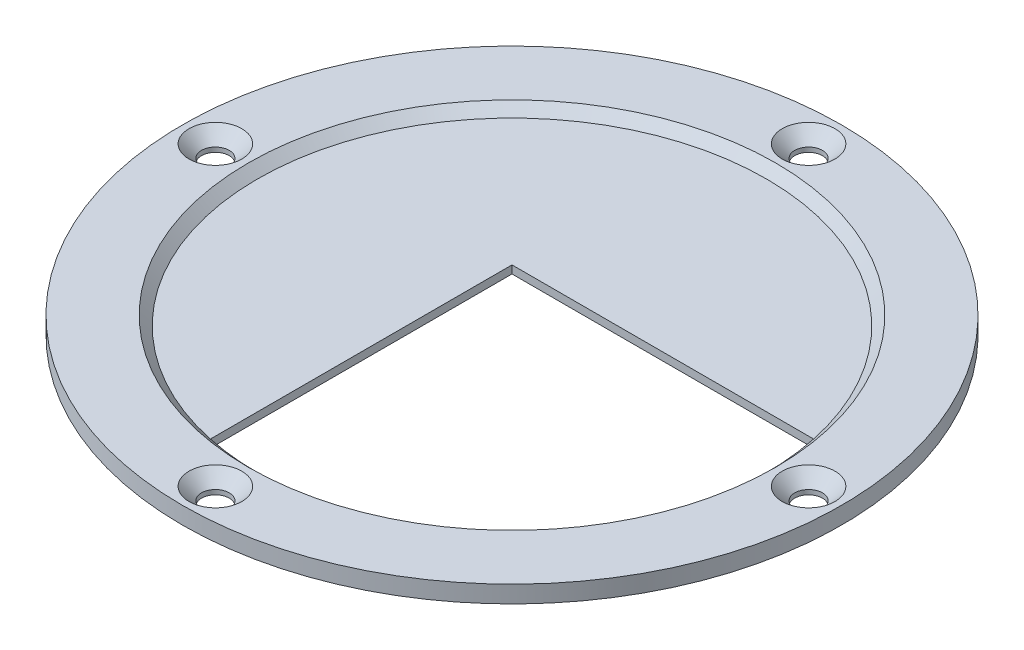
ISO-10303-21;
HEADER;
FILE_DESCRIPTION(('STEP AP214'),'2;1');
FILE_NAME('part.step','',(''),(''),'','','');
FILE_SCHEMA(('AUTOMOTIVE_DESIGN { 1 0 10303 214 1 1 1 1 }'));
ENDSEC;
DATA;
#1=APPLICATION_CONTEXT('core data for automotive mechanical design processes');
#2=APPLICATION_PROTOCOL_DEFINITION('international standard','automotive_design',2000,#1);
#3=PRODUCT_CONTEXT('',#1,'mechanical');
#4=PRODUCT('Part','Part','',(#3));
#5=PRODUCT_RELATED_PRODUCT_CATEGORY('part','',(#4));
#6=PRODUCT_DEFINITION_FORMATION('','',#4);
#7=PRODUCT_DEFINITION_CONTEXT('part definition',#1,'design');
#8=PRODUCT_DEFINITION('design','',#6,#7);
#9=PRODUCT_DEFINITION_SHAPE('','',#8);
#10=(LENGTH_UNIT() NAMED_UNIT(*) SI_UNIT(.MILLI.,.METRE.));
#11=(NAMED_UNIT(*) PLANE_ANGLE_UNIT() SI_UNIT($,.RADIAN.));
#12=(NAMED_UNIT(*) SI_UNIT($,.STERADIAN.) SOLID_ANGLE_UNIT());
#13=UNCERTAINTY_MEASURE_WITH_UNIT(LENGTH_MEASURE(1.E-05),#10,'distance_accuracy_value','');
#14=(GEOMETRIC_REPRESENTATION_CONTEXT(3) GLOBAL_UNCERTAINTY_ASSIGNED_CONTEXT((#13)) GLOBAL_UNIT_ASSIGNED_CONTEXT((#10,
#11,#12)) REPRESENTATION_CONTEXT('',''));
#15=CARTESIAN_POINT('',(0.,0.,0.));
#16=DIRECTION('',(0.,0.,1.));
#17=DIRECTION('',(1.,0.,0.));
#18=AXIS2_PLACEMENT_3D('',#15,#16,#17);
#19=CARTESIAN_POINT('',(0.,1.2,0.));
#20=DIRECTION('',(0.,1.,0.));
#21=DIRECTION('',(0.,0.,1.));
#22=AXIS2_PLACEMENT_3D('',#19,#20,#21);
#23=PLANE('',#22);
#24=DIRECTION('',(-1.,0.,0.));
#25=VECTOR('',#24,1.);
#26=CARTESIAN_POINT('',(-8.,1.2,-8.));
#27=LINE('',#26,#25);
#28=CARTESIAN_POINT('',(37.7618855461429,1.2,-8.));
#29=VERTEX_POINT('',#28);
#30=CARTESIAN_POINT('',(-8.,1.2,-8.));
#31=VERTEX_POINT('',#30);
#32=EDGE_CURVE('E90',#29,#31,#27,.T.);
#33=ORIENTED_EDGE('',*,*,#32,.F.);
#34=CARTESIAN_POINT('',(0.,1.2,0.));
#35=DIRECTION('',(0.,1.,0.));
#36=DIRECTION('',(0.,0.,1.));
#37=AXIS2_PLACEMENT_3D('',#34,#35,#36);
#38=CIRCLE('',#37,38.6);
#39=CARTESIAN_POINT('',(-8.00000000000002,1.2,37.7618855461429));
#40=VERTEX_POINT('',#39);
#41=EDGE_CURVE('E86',#29,#40,#38,.T.);
#42=ORIENTED_EDGE('',*,*,#41,.T.);
#43=DIRECTION('',(0.,0.,1.));
#44=VECTOR('',#43,1.);
#45=CARTESIAN_POINT('',(-8.,1.2,0.));
#46=LINE('',#45,#44);
#47=EDGE_CURVE('E91',#31,#40,#46,.T.);
#48=ORIENTED_EDGE('',*,*,#47,.F.);
#49=EDGE_LOOP('',(#33,#42,#48));
#50=FACE_BOUND('',#49,.T.);
#51=ADVANCED_FACE('F47',(#50),#23,.T.);
#52=CARTESIAN_POINT('',(0.,0.,0.));
#53=DIRECTION('',(0.,1.,0.));
#54=DIRECTION('',(0.,0.,1.));
#55=AXIS2_PLACEMENT_3D('',#52,#53,#54);
#56=PLANE('',#55);
#57=CARTESIAN_POINT('',(-45.,0.,0.));
#58=DIRECTION('',(0.,1.,0.));
#59=DIRECTION('',(0.,0.,-1.));
#60=AXIS2_PLACEMENT_3D('',#57,#58,#59);
#61=CIRCLE('',#60,2.1);
#62=CARTESIAN_POINT('',(-45.,0.,-2.1));
#63=VERTEX_POINT('',#62);
#64=EDGE_CURVE('E109',#63,#63,#61,.T.);
#65=ORIENTED_EDGE('',*,*,#64,.T.);
#66=EDGE_LOOP('',(#65));
#67=FACE_BOUND('',#66,.T.);
#68=CARTESIAN_POINT('',(0.,0.,45.));
#69=DIRECTION('',(0.,1.,0.));
#70=DIRECTION('',(0.,0.,-1.));
#71=AXIS2_PLACEMENT_3D('',#68,#69,#70);
#72=CIRCLE('',#71,2.1);
#73=CARTESIAN_POINT('',(0.,0.,42.9));
#74=VERTEX_POINT('',#73);
#75=EDGE_CURVE('E115',#74,#74,#72,.T.);
#76=ORIENTED_EDGE('',*,*,#75,.T.);
#77=EDGE_LOOP('',(#76));
#78=FACE_BOUND('',#77,.T.);
#79=CARTESIAN_POINT('',(0.,0.,-45.));
#80=DIRECTION('',(0.,1.,0.));
#81=DIRECTION('',(0.,0.,1.));
#82=AXIS2_PLACEMENT_3D('',#79,#80,#81);
#83=CIRCLE('',#82,2.1);
#84=CARTESIAN_POINT('',(0.,0.,-42.9));
#85=VERTEX_POINT('',#84);
#86=EDGE_CURVE('E123',#85,#85,#83,.T.);
#87=ORIENTED_EDGE('',*,*,#86,.T.);
#88=EDGE_LOOP('',(#87));
#89=FACE_BOUND('',#88,.T.);
#90=CARTESIAN_POINT('',(45.,0.,0.));
#91=DIRECTION('',(0.,1.,0.));
#92=DIRECTION('',(0.,0.,1.));
#93=AXIS2_PLACEMENT_3D('',#90,#91,#92);
#94=CIRCLE('',#93,2.1);
#95=CARTESIAN_POINT('',(45.,0.,2.1));
#96=VERTEX_POINT('',#95);
#97=EDGE_CURVE('E127',#96,#96,#94,.T.);
#98=ORIENTED_EDGE('',*,*,#97,.T.);
#99=EDGE_LOOP('',(#98));
#100=FACE_BOUND('',#99,.T.);
#101=CARTESIAN_POINT('',(0.,0.,0.));
#102=DIRECTION('',(0.,1.,0.));
#103=DIRECTION('',(0.,0.,1.));
#104=AXIS2_PLACEMENT_3D('',#101,#102,#103);
#105=CIRCLE('',#104,50.);
#106=CARTESIAN_POINT('',(0.,0.,50.));
#107=VERTEX_POINT('',#106);
#108=EDGE_CURVE('E98',#107,#107,#105,.T.);
#109=ORIENTED_EDGE('',*,*,#108,.F.);
#110=EDGE_LOOP('',(#109));
#111=FACE_BOUND('',#110,.T.);
#112=CARTESIAN_POINT('',(0.,0.,0.));
#113=DIRECTION('',(0.,1.,0.));
#114=DIRECTION('',(0.,0.,1.));
#115=AXIS2_PLACEMENT_3D('',#112,#113,#114);
#116=CIRCLE('',#115,38.6);
#117=CARTESIAN_POINT('',(-8.,0.,37.7618855461429));
#118=VERTEX_POINT('',#117);
#119=CARTESIAN_POINT('',(37.7618855461429,0.,-8.));
#120=VERTEX_POINT('',#119);
#121=EDGE_CURVE('E106',#118,#120,#116,.T.);
#122=ORIENTED_EDGE('',*,*,#121,.T.);
#123=DIRECTION('',(-1.,0.,0.));
#124=VECTOR('',#123,1.);
#125=CARTESIAN_POINT('',(-8.,0.,-8.));
#126=LINE('',#125,#124);
#127=CARTESIAN_POINT('',(-8.,0.,-8.));
#128=VERTEX_POINT('',#127);
#129=EDGE_CURVE('E236',#120,#128,#126,.T.);
#130=ORIENTED_EDGE('',*,*,#129,.T.);
#131=DIRECTION('',(0.,0.,1.));
#132=VECTOR('',#131,1.);
#133=CARTESIAN_POINT('',(-8.,0.,0.));
#134=LINE('',#133,#132);
#135=EDGE_CURVE('E102',#128,#118,#134,.T.);
#136=ORIENTED_EDGE('',*,*,#135,.T.);
#137=EDGE_LOOP('',(#122,#130,#136));
#138=FACE_BOUND('',#137,.T.);
#139=ADVANCED_FACE('F178',(#67,#78,#89,#100,#111,#138),#56,.F.);
#140=CARTESIAN_POINT('',(0.,1.2,0.));
#141=DIRECTION('',(0.,-1.,0.));
#142=DIRECTION('',(0.,0.,-1.));
#143=AXIS2_PLACEMENT_3D('',#140,#141,#142);
#144=CYLINDRICAL_SURFACE('',#143,50.);
#145=ORIENTED_EDGE('',*,*,#108,.T.);
#146=EDGE_LOOP('',(#145));
#147=FACE_BOUND('',#146,.T.);
#148=CARTESIAN_POINT('',(0.,2.6,0.));
#149=DIRECTION('',(0.,1.,0.));
#150=DIRECTION('',(0.,0.,1.));
#151=AXIS2_PLACEMENT_3D('',#148,#149,#150);
#152=CIRCLE('',#151,50.);
#153=CARTESIAN_POINT('',(0.,2.6,50.));
#154=VERTEX_POINT('',#153);
#155=EDGE_CURVE('E238',#154,#154,#152,.T.);
#156=ORIENTED_EDGE('',*,*,#155,.F.);
#157=EDGE_LOOP('',(#156));
#158=FACE_BOUND('',#157,.T.);
#159=ADVANCED_FACE('F185',(#147,#158),#144,.T.);
#160=CARTESIAN_POINT('',(45.,1.2,0.));
#161=DIRECTION('',(0.,-1.,0.));
#162=DIRECTION('',(0.,0.,-1.));
#163=AXIS2_PLACEMENT_3D('',#160,#161,#162);
#164=CYLINDRICAL_SURFACE('',#163,2.1);
#165=CARTESIAN_POINT('',(45.,0.699999999999986,0.));
#166=DIRECTION('',(0.,1.,0.));
#167=DIRECTION('',(0.,0.,1.));
#168=AXIS2_PLACEMENT_3D('',#165,#166,#167);
#169=CIRCLE('',#168,2.1);
#170=CARTESIAN_POINT('',(45.,0.699999999999986,2.1));
#171=VERTEX_POINT('',#170);
#172=EDGE_CURVE('E153',#171,#171,#169,.T.);
#173=ORIENTED_EDGE('',*,*,#172,.T.);
#174=EDGE_LOOP('',(#173));
#175=FACE_BOUND('',#174,.T.);
#176=ORIENTED_EDGE('',*,*,#97,.F.);
#177=EDGE_LOOP('',(#176));
#178=FACE_BOUND('',#177,.T.);
#179=ADVANCED_FACE('F189',(#175,#178),#164,.F.);
#180=CARTESIAN_POINT('',(0.,1.2,-45.));
#181=DIRECTION('',(0.,-1.,0.));
#182=DIRECTION('',(0.,0.,-1.));
#183=AXIS2_PLACEMENT_3D('',#180,#181,#182);
#184=CYLINDRICAL_SURFACE('',#183,2.1);
#185=CARTESIAN_POINT('',(0.,0.699999999999989,-45.));
#186=DIRECTION('',(0.,1.,0.));
#187=DIRECTION('',(0.,0.,1.));
#188=AXIS2_PLACEMENT_3D('',#185,#186,#187);
#189=CIRCLE('',#188,2.1);
#190=CARTESIAN_POINT('',(0.,0.699999999999989,-42.9));
#191=VERTEX_POINT('',#190);
#192=EDGE_CURVE('E57',#191,#191,#189,.T.);
#193=ORIENTED_EDGE('',*,*,#192,.T.);
#194=EDGE_LOOP('',(#193));
#195=FACE_BOUND('',#194,.T.);
#196=ORIENTED_EDGE('',*,*,#86,.F.);
#197=EDGE_LOOP('',(#196));
#198=FACE_BOUND('',#197,.T.);
#199=ADVANCED_FACE('F160',(#195,#198),#184,.F.);
#200=CARTESIAN_POINT('',(0.,1.2,45.));
#201=DIRECTION('',(0.,-1.,0.));
#202=DIRECTION('',(0.,0.,-1.));
#203=AXIS2_PLACEMENT_3D('',#200,#201,#202);
#204=CYLINDRICAL_SURFACE('',#203,2.1);
#205=CARTESIAN_POINT('',(0.,0.699999999999987,45.));
#206=DIRECTION('',(0.,1.,0.));
#207=DIRECTION('',(0.,0.,1.));
#208=AXIS2_PLACEMENT_3D('',#205,#206,#207);
#209=CIRCLE('',#208,2.1);
#210=CARTESIAN_POINT('',(0.,0.699999999999987,47.1));
#211=VERTEX_POINT('',#210);
#212=EDGE_CURVE('E97',#211,#211,#209,.T.);
#213=ORIENTED_EDGE('',*,*,#212,.T.);
#214=EDGE_LOOP('',(#213));
#215=FACE_BOUND('',#214,.T.);
#216=ORIENTED_EDGE('',*,*,#75,.F.);
#217=EDGE_LOOP('',(#216));
#218=FACE_BOUND('',#217,.T.);
#219=ADVANCED_FACE('F220',(#215,#218),#204,.F.);
#220=CARTESIAN_POINT('',(-45.,1.2,0.));
#221=DIRECTION('',(0.,-1.,0.));
#222=DIRECTION('',(0.,0.,-1.));
#223=AXIS2_PLACEMENT_3D('',#220,#221,#222);
#224=CYLINDRICAL_SURFACE('',#223,2.1);
#225=CARTESIAN_POINT('',(-45.,0.699999999999986,0.));
#226=DIRECTION('',(0.,1.,0.));
#227=DIRECTION('',(0.,0.,1.));
#228=AXIS2_PLACEMENT_3D('',#225,#226,#227);
#229=CIRCLE('',#228,2.1);
#230=CARTESIAN_POINT('',(-45.,0.699999999999986,2.1));
#231=VERTEX_POINT('',#230);
#232=EDGE_CURVE('E11',#231,#231,#229,.T.);
#233=ORIENTED_EDGE('',*,*,#232,.T.);
#234=EDGE_LOOP('',(#233));
#235=FACE_BOUND('',#234,.T.);
#236=ORIENTED_EDGE('',*,*,#64,.F.);
#237=EDGE_LOOP('',(#236));
#238=FACE_BOUND('',#237,.T.);
#239=ADVANCED_FACE('F223',(#235,#238),#224,.F.);
#240=CARTESIAN_POINT('',(0.,1.2,0.));
#241=DIRECTION('',(0.,-1.,0.));
#242=DIRECTION('',(0.,0.,-1.));
#243=AXIS2_PLACEMENT_3D('',#240,#241,#242);
#244=CYLINDRICAL_SURFACE('',#243,38.6);
#245=ORIENTED_EDGE('',*,*,#121,.F.);
#246=DIRECTION('',(0.,-1.,0.));
#247=VECTOR('',#246,1.);
#248=CARTESIAN_POINT('',(-8.00000000000002,1.2,37.7618855461429));
#249=LINE('',#248,#247);
#250=EDGE_CURVE('E69',#40,#118,#249,.T.);
#251=ORIENTED_EDGE('',*,*,#250,.F.);
#252=CARTESIAN_POINT('',(0.,1.2,0.));
#253=DIRECTION('',(0.,1.,0.));
#254=DIRECTION('',(0.,0.,1.));
#255=AXIS2_PLACEMENT_3D('',#252,#253,#254);
#256=CIRCLE('',#255,38.6);
#257=EDGE_CURVE('E83',#40,#29,#256,.T.);
#258=ORIENTED_EDGE('',*,*,#257,.T.);
#259=DIRECTION('',(0.,-1.,0.));
#260=VECTOR('',#259,1.);
#261=CARTESIAN_POINT('',(37.7618855461429,1.2,-8.));
#262=LINE('',#261,#260);
#263=EDGE_CURVE('E110',#29,#120,#262,.T.);
#264=ORIENTED_EDGE('',*,*,#263,.T.);
#265=EDGE_LOOP('',(#245,#251,#258,#264));
#266=FACE_BOUND('',#265,.T.);
#267=ADVANCED_FACE('F104',(#266),#244,.F.);
#268=CARTESIAN_POINT('',(-8.,1.2,-8.));
#269=DIRECTION('',(0.,0.,1.));
#270=DIRECTION('',(1.,0.,0.));
#271=AXIS2_PLACEMENT_3D('',#268,#269,#270);
#272=PLANE('',#271);
#273=ORIENTED_EDGE('',*,*,#129,.F.);
#274=ORIENTED_EDGE('',*,*,#263,.F.);
#275=ORIENTED_EDGE('',*,*,#32,.T.);
#276=DIRECTION('',(0.,-1.,0.));
#277=VECTOR('',#276,1.);
#278=CARTESIAN_POINT('',(-8.,1.2,-8.));
#279=LINE('',#278,#277);
#280=EDGE_CURVE('E64',#31,#128,#279,.T.);
#281=ORIENTED_EDGE('',*,*,#280,.T.);
#282=EDGE_LOOP('',(#273,#274,#275,#281));
#283=FACE_BOUND('',#282,.T.);
#284=ADVANCED_FACE('F252',(#283),#272,.T.);
#285=CARTESIAN_POINT('',(-8.,1.2,0.));
#286=DIRECTION('',(1.,0.,0.));
#287=DIRECTION('',(0.,0.,-1.));
#288=AXIS2_PLACEMENT_3D('',#285,#286,#287);
#289=PLANE('',#288);
#290=ORIENTED_EDGE('',*,*,#135,.F.);
#291=ORIENTED_EDGE('',*,*,#280,.F.);
#292=ORIENTED_EDGE('',*,*,#47,.T.);
#293=ORIENTED_EDGE('',*,*,#250,.T.);
#294=EDGE_LOOP('',(#290,#291,#292,#293));
#295=FACE_BOUND('',#294,.T.);
#296=ADVANCED_FACE('F100',(#295),#289,.T.);
#297=CARTESIAN_POINT('',(0.,2.6,0.));
#298=DIRECTION('',(0.,1.,0.));
#299=DIRECTION('',(0.,0.,1.));
#300=AXIS2_PLACEMENT_3D('',#297,#298,#299);
#301=PLANE('',#300);
#302=CARTESIAN_POINT('',(0.,2.6,45.));
#303=DIRECTION('',(0.,1.,0.));
#304=DIRECTION('',(0.,0.,1.));
#305=AXIS2_PLACEMENT_3D('',#302,#303,#304);
#306=CIRCLE('',#305,4.00000000000002);
#307=CARTESIAN_POINT('',(0.,2.6,49.));
#308=VERTEX_POINT('',#307);
#309=EDGE_CURVE('E149',#308,#308,#306,.F.);
#310=ORIENTED_EDGE('',*,*,#309,.T.);
#311=EDGE_LOOP('',(#310));
#312=FACE_BOUND('',#311,.T.);
#313=CARTESIAN_POINT('',(45.,2.6,0.));
#314=DIRECTION('',(0.,1.,0.));
#315=DIRECTION('',(0.,0.,1.));
#316=AXIS2_PLACEMENT_3D('',#313,#314,#315);
#317=CIRCLE('',#316,4.00000000000002);
#318=CARTESIAN_POINT('',(45.,2.6,4.00000000000002));
#319=VERTEX_POINT('',#318);
#320=EDGE_CURVE('E145',#319,#319,#317,.F.);
#321=ORIENTED_EDGE('',*,*,#320,.T.);
#322=EDGE_LOOP('',(#321));
#323=FACE_BOUND('',#322,.T.);
#324=CARTESIAN_POINT('',(0.,2.6,-45.));
#325=DIRECTION('',(0.,1.,0.));
#326=DIRECTION('',(0.,0.,1.));
#327=AXIS2_PLACEMENT_3D('',#324,#325,#326);
#328=CIRCLE('',#327,4.00000000000002);
#329=CARTESIAN_POINT('',(0.,2.6,-41.));
#330=VERTEX_POINT('',#329);
#331=EDGE_CURVE('E141',#330,#330,#328,.F.);
#332=ORIENTED_EDGE('',*,*,#331,.T.);
#333=EDGE_LOOP('',(#332));
#334=FACE_BOUND('',#333,.T.);
#335=CARTESIAN_POINT('',(-45.,2.6,0.));
#336=DIRECTION('',(0.,1.,0.));
#337=DIRECTION('',(0.,0.,1.));
#338=AXIS2_PLACEMENT_3D('',#335,#336,#337);
#339=CIRCLE('',#338,4.00000000000002);
#340=CARTESIAN_POINT('',(-45.,2.6,4.00000000000002));
#341=VERTEX_POINT('',#340);
#342=EDGE_CURVE('E137',#341,#341,#339,.F.);
#343=ORIENTED_EDGE('',*,*,#342,.T.);
#344=EDGE_LOOP('',(#343));
#345=FACE_BOUND('',#344,.T.);
#346=ORIENTED_EDGE('',*,*,#155,.T.);
#347=EDGE_LOOP('',(#346));
#348=FACE_BOUND('',#347,.T.);
#349=CARTESIAN_POINT('',(0.,2.6,0.));
#350=DIRECTION('',(0.,1.,0.));
#351=DIRECTION('',(0.,0.,1.));
#352=AXIS2_PLACEMENT_3D('',#349,#350,#351);
#353=CIRCLE('',#352,40.);
#354=CARTESIAN_POINT('',(0.,2.6,40.));
#355=VERTEX_POINT('',#354);
#356=EDGE_CURVE('E244',#355,#355,#353,.T.);
#357=ORIENTED_EDGE('',*,*,#356,.F.);
#358=EDGE_LOOP('',(#357));
#359=FACE_BOUND('',#358,.T.);
#360=ADVANCED_FACE('F200',(#312,#323,#334,#345,#348,#359),#301,.T.);
#361=CARTESIAN_POINT('',(0.,1.2,0.));
#362=DIRECTION('',(0.,1.,0.));
#363=DIRECTION('',(0.,0.,1.));
#364=AXIS2_PLACEMENT_3D('',#361,#362,#363);
#365=CONICAL_SURFACE('',#364,38.6,0.785398163397458);
#366=ORIENTED_EDGE('',*,*,#356,.T.);
#367=EDGE_LOOP('',(#366));
#368=FACE_BOUND('',#367,.T.);
#369=ORIENTED_EDGE('',*,*,#257,.F.);
#370=ORIENTED_EDGE('',*,*,#41,.F.);
#371=EDGE_LOOP('',(#369,#370));
#372=FACE_BOUND('',#371,.T.);
#373=ADVANCED_FACE('F85',(#368,#372),#365,.F.);
#374=CARTESIAN_POINT('',(0.,0.699999999999987,45.));
#375=DIRECTION('',(0.,1.,0.));
#376=DIRECTION('',(0.,0.,1.));
#377=AXIS2_PLACEMENT_3D('',#374,#375,#376);
#378=CONICAL_SURFACE('',#377,2.1,0.78539816339745);
#379=ORIENTED_EDGE('',*,*,#309,.F.);
#380=EDGE_LOOP('',(#379));
#381=FACE_BOUND('',#380,.T.);
#382=ORIENTED_EDGE('',*,*,#212,.F.);
#383=EDGE_LOOP('',(#382));
#384=FACE_BOUND('',#383,.T.);
#385=ADVANCED_FACE('F172',(#381,#384),#378,.F.);
#386=CARTESIAN_POINT('',(45.,0.699999999999986,0.));
#387=DIRECTION('',(0.,1.,0.));
#388=DIRECTION('',(0.,0.,1.));
#389=AXIS2_PLACEMENT_3D('',#386,#387,#388);
#390=CONICAL_SURFACE('',#389,2.1,0.78539816339745);
#391=ORIENTED_EDGE('',*,*,#320,.F.);
#392=EDGE_LOOP('',(#391));
#393=FACE_BOUND('',#392,.T.);
#394=ORIENTED_EDGE('',*,*,#172,.F.);
#395=EDGE_LOOP('',(#394));
#396=FACE_BOUND('',#395,.T.);
#397=ADVANCED_FACE('F165',(#393,#396),#390,.F.);
#398=CARTESIAN_POINT('',(0.,0.699999999999989,-45.));
#399=DIRECTION('',(0.,1.,0.));
#400=DIRECTION('',(0.,0.,1.));
#401=AXIS2_PLACEMENT_3D('',#398,#399,#400);
#402=CONICAL_SURFACE('',#401,2.1,0.78539816339745);
#403=CARTESIAN_POINT('',(0.,2.6,-41.));
#404=CARTESIAN_POINT('',(0.,2.58020833333333,-41.0197916666666));
#405=CARTESIAN_POINT('',(0.,2.56041666666667,-41.0395833333333));
#406=CARTESIAN_POINT('',(0.,2.52083333333333,-41.0791666666666));
#407=CARTESIAN_POINT('',(0.,2.50104166666667,-41.0989583333333));
#408=CARTESIAN_POINT('',(0.,2.46145833333333,-41.1385416666666));
#409=CARTESIAN_POINT('',(0.,2.44166666666667,-41.1583333333333));
#410=CARTESIAN_POINT('',(0.,2.40208333333333,-41.1979166666667));
#411=CARTESIAN_POINT('',(0.,2.38229166666666,-41.2177083333333));
#412=CARTESIAN_POINT('',(0.,2.34270833333333,-41.2572916666666));
#413=CARTESIAN_POINT('',(0.,2.32291666666666,-41.2770833333333));
#414=CARTESIAN_POINT('',(0.,2.28333333333333,-41.3166666666666));
#415=CARTESIAN_POINT('',(0.,2.26354166666666,-41.3364583333333));
#416=CARTESIAN_POINT('',(0.,2.22395833333333,-41.3760416666666));
#417=CARTESIAN_POINT('',(0.,2.20416666666666,-41.3958333333333));
#418=CARTESIAN_POINT('',(0.,2.16458333333333,-41.4354166666666));
#419=CARTESIAN_POINT('',(0.,2.14479166666666,-41.4552083333333));
#420=CARTESIAN_POINT('',(0.,2.10520833333333,-41.4947916666667));
#421=CARTESIAN_POINT('',(0.,2.08541666666666,-41.5145833333333));
#422=CARTESIAN_POINT('',(0.,2.04583333333333,-41.5541666666666));
#423=CARTESIAN_POINT('',(0.,2.02604166666666,-41.5739583333333));
#424=CARTESIAN_POINT('',(0.,1.98645833333333,-41.6135416666666));
#425=CARTESIAN_POINT('',(0.,1.96666666666666,-41.6333333333333));
#426=CARTESIAN_POINT('',(0.,1.92708333333333,-41.6729166666667));
#427=CARTESIAN_POINT('',(0.,1.90729166666666,-41.6927083333333));
#428=CARTESIAN_POINT('',(0.,1.86770833333333,-41.7322916666666));
#429=CARTESIAN_POINT('',(0.,1.84791666666666,-41.7520833333333));
#430=CARTESIAN_POINT('',(0.,1.80833333333333,-41.7916666666667));
#431=CARTESIAN_POINT('',(0.,1.78854166666666,-41.8114583333333));
#432=CARTESIAN_POINT('',(0.,1.74895833333333,-41.8510416666667));
#433=CARTESIAN_POINT('',(0.,1.72916666666666,-41.8708333333333));
#434=CARTESIAN_POINT('',(0.,1.68958333333333,-41.9104166666666));
#435=CARTESIAN_POINT('',(0.,1.66979166666666,-41.9302083333333));
#436=CARTESIAN_POINT('',(0.,1.63020833333333,-41.9697916666667));
#437=CARTESIAN_POINT('',(0.,1.61041666666666,-41.9895833333333));
#438=CARTESIAN_POINT('',(0.,1.57083333333333,-42.0291666666667));
#439=CARTESIAN_POINT('',(0.,1.55104166666666,-42.0489583333333));
#440=CARTESIAN_POINT('',(0.,1.51145833333333,-42.0885416666667));
#441=CARTESIAN_POINT('',(0.,1.49166666666666,-42.1083333333333));
#442=CARTESIAN_POINT('',(0.,1.45208333333333,-42.1479166666667));
#443=CARTESIAN_POINT('',(0.,1.43229166666666,-42.1677083333333));
#444=CARTESIAN_POINT('',(0.,1.39270833333333,-42.2072916666667));
#445=CARTESIAN_POINT('',(0.,1.37291666666666,-42.2270833333333));
#446=CARTESIAN_POINT('',(0.,1.33333333333333,-42.2666666666667));
#447=CARTESIAN_POINT('',(0.,1.31354166666666,-42.2864583333333));
#448=CARTESIAN_POINT('',(0.,1.27395833333333,-42.3260416666667));
#449=CARTESIAN_POINT('',(0.,1.25416666666666,-42.3458333333333));
#450=CARTESIAN_POINT('',(0.,1.21458333333332,-42.3854166666667));
#451=CARTESIAN_POINT('',(0.,1.19479166666666,-42.4052083333333));
#452=CARTESIAN_POINT('',(0.,1.15520833333333,-42.4447916666667));
#453=CARTESIAN_POINT('',(0.,1.13541666666666,-42.4645833333333));
#454=CARTESIAN_POINT('',(0.,1.09583333333332,-42.5041666666667));
#455=CARTESIAN_POINT('',(0.,1.07604166666666,-42.5239583333333));
#456=CARTESIAN_POINT('',(0.,1.03645833333332,-42.5635416666667));
#457=CARTESIAN_POINT('',(0.,1.01666666666666,-42.5833333333333));
#458=CARTESIAN_POINT('',(0.,0.977083333333324,-42.6229166666667));
#459=CARTESIAN_POINT('',(0.,0.957291666666657,-42.6427083333333));
#460=CARTESIAN_POINT('',(0.,0.917708333333323,-42.6822916666667));
#461=CARTESIAN_POINT('',(0.,0.897916666666657,-42.7020833333333));
#462=CARTESIAN_POINT('',(0.,0.858333333333323,-42.7416666666667));
#463=CARTESIAN_POINT('',(0.,0.838541666666656,-42.7614583333333));
#464=CARTESIAN_POINT('',(0.,0.798958333333323,-42.8010416666667));
#465=CARTESIAN_POINT('',(0.,0.779166666666656,-42.8208333333333));
#466=CARTESIAN_POINT('',(0.,0.739583333333322,-42.8604166666667));
#467=CARTESIAN_POINT('',(0.,0.719791666666656,-42.8802083333333));
#468=CARTESIAN_POINT('',(0.,0.699999999999989,-42.9));
#469=B_SPLINE_CURVE_WITH_KNOTS('',3,(#403,#404,#405,#406,#407,#408,#409,#410,#411,#412,#413,
#414,#415,#416,#417,#418,#419,#420,#421,#422,#423,#424,#425,#426,#427,#428,#429,#430,#431,#432,
#433,#434,#435,#436,#437,#438,#439,#440,#441,#442,#443,#444,#445,#446,#447,#448,#449,#450,#451,
#452,#453,#454,#455,#456,#457,#458,#459,#460,#461,#462,#463,#464,#465,#466,#467,#468),
.UNSPECIFIED.,.F.,.F.,(4,2,2,2,2,2,2,2,2,2,2,2,2,2,2,2,2,2,2,2,2,2,2,2,2,2,2,2,2,2,2,2,4),(0.,
0.0839689302659031,0.167937860531806,0.251906790797709,0.335875721063612,0.419844651329515,
0.503813581595419,0.587782511861322,0.671751442127225,0.755720372393128,0.839689302659031,
0.923658232924934,1.00762716319084,1.09159609345674,1.17556502372264,1.25953395398855,
1.34350288425445,1.42747181452035,1.51144074478626,1.59540967505216,1.67937860531806,
1.76334753558396,1.84731646584987,1.93128539611577,2.01525432638168,2.09922325664758,
2.18319218691349,2.26716111717939,2.35113004744529,2.43509897771119,2.5190679079771,
2.603036838243,2.6870057685089),.UNSPECIFIED.);
#470=EDGE_CURVE('BSEAM163',#330,#191,#469,.T.);
#471=ORIENTED_EDGE('',*,*,#331,.F.);
#472=ORIENTED_EDGE('',*,*,#192,.F.);
#473=ORIENTED_EDGE('',*,*,#470,.T.);
#474=ORIENTED_EDGE('',*,*,#470,.F.);
#475=EDGE_LOOP('',(#471,#473,#472,#474));
#476=FACE_BOUND('',#475,.T.);
#477=ADVANCED_FACE('F163',(#476),#402,.F.);
#478=CARTESIAN_POINT('',(-45.,0.699999999999986,0.));
#479=DIRECTION('',(0.,1.,0.));
#480=DIRECTION('',(0.,0.,1.));
#481=AXIS2_PLACEMENT_3D('',#478,#479,#480);
#482=CONICAL_SURFACE('',#481,2.1,0.78539816339745);
#483=ORIENTED_EDGE('',*,*,#342,.F.);
#484=EDGE_LOOP('',(#483));
#485=FACE_BOUND('',#484,.T.);
#486=ORIENTED_EDGE('',*,*,#232,.F.);
#487=EDGE_LOOP('',(#486));
#488=FACE_BOUND('',#487,.T.);
#489=ADVANCED_FACE('F50',(#485,#488),#482,.F.);
#490=CLOSED_SHELL('',(#51,#139,#159,#179,#199,#219,#239,#267,#284,#296,#360,#373,#385,#397,#477,#489));
#491=MANIFOLD_SOLID_BREP('B2',#490);
#492=ADVANCED_BREP_SHAPE_REPRESENTATION('',(#18,#491),#14);
#493=SHAPE_DEFINITION_REPRESENTATION(#9,#492);
ENDSEC;
END-ISO-10303-21;
